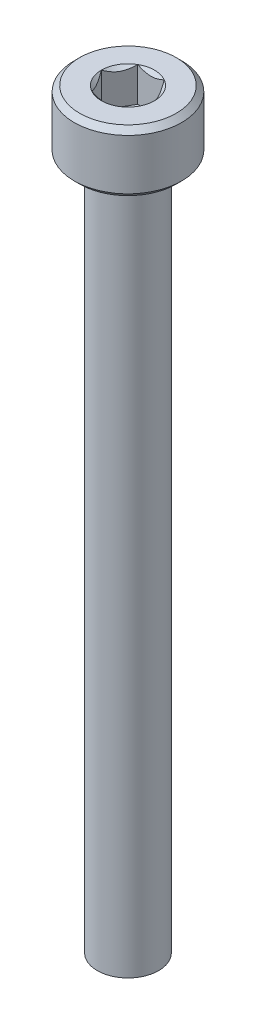
ISO-10303-21;
HEADER;
FILE_DESCRIPTION(('STEP AP214'),'2;1');
FILE_NAME('part.step','',(''),(''),'','','');
FILE_SCHEMA(('AUTOMOTIVE_DESIGN { 1 0 10303 214 1 1 1 1 }'));
ENDSEC;
DATA;
#1=APPLICATION_CONTEXT('core data for automotive mechanical design processes');
#2=APPLICATION_PROTOCOL_DEFINITION('international standard','automotive_design',2000,#1);
#3=PRODUCT_CONTEXT('',#1,'mechanical');
#4=PRODUCT('Part','Part','',(#3));
#5=PRODUCT_RELATED_PRODUCT_CATEGORY('part','',(#4));
#6=PRODUCT_DEFINITION_FORMATION('','',#4);
#7=PRODUCT_DEFINITION_CONTEXT('part definition',#1,'design');
#8=PRODUCT_DEFINITION('design','',#6,#7);
#9=PRODUCT_DEFINITION_SHAPE('','',#8);
#10=(LENGTH_UNIT() NAMED_UNIT(*) SI_UNIT(.MILLI.,.METRE.));
#11=(NAMED_UNIT(*) PLANE_ANGLE_UNIT() SI_UNIT($,.RADIAN.));
#12=(NAMED_UNIT(*) SI_UNIT($,.STERADIAN.) SOLID_ANGLE_UNIT());
#13=UNCERTAINTY_MEASURE_WITH_UNIT(LENGTH_MEASURE(1.E-05),#10,'distance_accuracy_value','');
#14=(GEOMETRIC_REPRESENTATION_CONTEXT(3) GLOBAL_UNCERTAINTY_ASSIGNED_CONTEXT((#13)) GLOBAL_UNIT_ASSIGNED_CONTEXT((#10,
#11,#12)) REPRESENTATION_CONTEXT('',''));
#15=CARTESIAN_POINT('',(0.,0.,0.));
#16=DIRECTION('',(0.,0.,1.));
#17=DIRECTION('',(1.,0.,0.));
#18=AXIS2_PLACEMENT_3D('',#15,#16,#17);
#19=CARTESIAN_POINT('',(0.,4.,0.));
#20=DIRECTION('',(0.,-1.,0.));
#21=DIRECTION('',(0.,0.,-1.));
#22=AXIS2_PLACEMENT_3D('',#19,#20,#21);
#23=CYLINDRICAL_SURFACE('',#22,3.5);
#24=CARTESIAN_POINT('',(0.,0.350000000000001,0.));
#25=DIRECTION('',(0.,1.,0.));
#26=DIRECTION('',(0.,0.,1.));
#27=AXIS2_PLACEMENT_3D('',#24,#25,#26);
#28=CIRCLE('',#27,3.5);
#29=CARTESIAN_POINT('',(0.,0.350000000000001,3.5));
#30=VERTEX_POINT('',#29);
#31=EDGE_CURVE('E227',#30,#30,#28,.T.);
#32=ORIENTED_EDGE('',*,*,#31,.T.);
#33=EDGE_LOOP('',(#32));
#34=FACE_BOUND('',#33,.T.);
#35=CARTESIAN_POINT('',(0.,3.65,0.));
#36=DIRECTION('',(0.,1.,0.));
#37=DIRECTION('',(0.,0.,1.));
#38=AXIS2_PLACEMENT_3D('',#35,#36,#37);
#39=CIRCLE('',#38,3.5);
#40=CARTESIAN_POINT('',(0.,3.65,3.5));
#41=VERTEX_POINT('',#40);
#42=EDGE_CURVE('E104',#41,#41,#39,.F.);
#43=ORIENTED_EDGE('',*,*,#42,.T.);
#44=EDGE_LOOP('',(#43));
#45=FACE_BOUND('',#44,.T.);
#46=ADVANCED_FACE('F32',(#34,#45),#23,.T.);
#47=CARTESIAN_POINT('',(0.,4.,0.));
#48=DIRECTION('',(0.,1.,0.));
#49=DIRECTION('',(0.,0.,1.));
#50=AXIS2_PLACEMENT_3D('',#47,#48,#49);
#51=PLANE('',#50);
#52=CARTESIAN_POINT('',(0.,4.,0.));
#53=DIRECTION('',(0.,1.,0.));
#54=DIRECTION('',(0.,0.,1.));
#55=AXIS2_PLACEMENT_3D('',#52,#53,#54);
#56=CIRCLE('',#55,3.15);
#57=CARTESIAN_POINT('',(0.,4.,3.15));
#58=VERTEX_POINT('',#57);
#59=EDGE_CURVE('E36',#58,#58,#56,.T.);
#60=ORIENTED_EDGE('',*,*,#59,.T.);
#61=EDGE_LOOP('',(#60));
#62=FACE_BOUND('',#61,.T.);
#63=CARTESIAN_POINT('',(0.,4.,0.));
#64=DIRECTION('',(0.,1.,0.));
#65=DIRECTION('',(0.,0.,1.));
#66=AXIS2_PLACEMENT_3D('',#63,#64,#65);
#67=CIRCLE('',#66,1.73205080756888);
#68=CARTESIAN_POINT('',(0.866025403784438,4.,1.5));
#69=VERTEX_POINT('',#68);
#70=CARTESIAN_POINT('',(1.73205080756888,4.,0.));
#71=VERTEX_POINT('',#70);
#72=EDGE_CURVE('E47',#69,#71,#67,.T.);
#73=ORIENTED_EDGE('',*,*,#72,.F.);
#74=CARTESIAN_POINT('',(-0.866025403784438,4.,1.5));
#75=VERTEX_POINT('',#74);
#76=EDGE_CURVE('E54',#75,#69,#67,.T.);
#77=ORIENTED_EDGE('',*,*,#76,.F.);
#78=CARTESIAN_POINT('',(-1.73205080756888,4.,0.));
#79=VERTEX_POINT('',#78);
#80=EDGE_CURVE('E127',#79,#75,#67,.T.);
#81=ORIENTED_EDGE('',*,*,#80,.F.);
#82=CARTESIAN_POINT('',(-0.866025403784439,4.,-1.5));
#83=VERTEX_POINT('',#82);
#84=EDGE_CURVE('E126',#83,#79,#67,.T.);
#85=ORIENTED_EDGE('',*,*,#84,.F.);
#86=CARTESIAN_POINT('',(0.866025403784438,4.,-1.5));
#87=VERTEX_POINT('',#86);
#88=EDGE_CURVE('E94',#87,#83,#67,.T.);
#89=ORIENTED_EDGE('',*,*,#88,.F.);
#90=EDGE_CURVE('E86',#71,#87,#67,.T.);
#91=ORIENTED_EDGE('',*,*,#90,.F.);
#92=EDGE_LOOP('',(#73,#77,#81,#85,#89,#91));
#93=FACE_BOUND('',#92,.T.);
#94=ADVANCED_FACE('F124',(#62,#93),#51,.T.);
#95=CARTESIAN_POINT('',(0.,0.,0.));
#96=DIRECTION('',(0.,1.,0.));
#97=DIRECTION('',(0.,0.,1.));
#98=AXIS2_PLACEMENT_3D('',#95,#96,#97);
#99=PLANE('',#98);
#100=CARTESIAN_POINT('',(0.,0.,0.));
#101=DIRECTION('',(0.,-1.,0.));
#102=DIRECTION('',(0.,0.,-1.));
#103=AXIS2_PLACEMENT_3D('',#100,#101,#102);
#104=CIRCLE('',#103,2.);
#105=CARTESIAN_POINT('',(0.,0.,2.));
#106=VERTEX_POINT('',#105);
#107=EDGE_CURVE('E11',#106,#106,#104,.T.);
#108=ORIENTED_EDGE('',*,*,#107,.F.);
#109=EDGE_LOOP('',(#108));
#110=FACE_BOUND('',#109,.T.);
#111=CARTESIAN_POINT('',(0.,0.,0.));
#112=DIRECTION('',(0.,1.,0.));
#113=DIRECTION('',(0.,0.,1.));
#114=AXIS2_PLACEMENT_3D('',#111,#112,#113);
#115=CIRCLE('',#114,3.15);
#116=CARTESIAN_POINT('',(0.,0.,3.15));
#117=VERTEX_POINT('',#116);
#118=EDGE_CURVE('E225',#117,#117,#115,.F.);
#119=ORIENTED_EDGE('',*,*,#118,.T.);
#120=EDGE_LOOP('',(#119));
#121=FACE_BOUND('',#120,.T.);
#122=ADVANCED_FACE('F208',(#110,#121),#99,.F.);
#123=CARTESIAN_POINT('',(0.,4.,0.));
#124=DIRECTION('',(0.,1.,0.));
#125=DIRECTION('',(0.,0.,1.));
#126=AXIS2_PLACEMENT_3D('',#123,#124,#125);
#127=CONICAL_SURFACE('',#126,1.73205080756888,0.78539816339745);
#128=ORIENTED_EDGE('',*,*,#88,.T.);
#129=CARTESIAN_POINT('',(-1.72720812969692,4.55557851627079,-1.5));
#130=CARTESIAN_POINT('',(-1.68515175699268,4.52382990785743,-1.5));
#131=CARTESIAN_POINT('',(-1.64286104748673,4.49239259380738,-1.5));
#132=CARTESIAN_POINT('',(-1.55771581035942,4.43026908755641,-1.5));
#133=CARTESIAN_POINT('',(-1.51486114386668,4.3995830858922,-1.5));
#134=CARTESIAN_POINT('',(-1.3846813415127,4.30840719242716,-1.5));
#135=CARTESIAN_POINT('',(-1.29637976071654,4.24928834342677,-1.5));
#136=CARTESIAN_POINT('',(-1.11121478730467,4.1332309963165,-1.5));
#137=CARTESIAN_POINT('',(-1.01415038238167,4.07660955873301,-1.5));
#138=CARTESIAN_POINT('',(-0.815173408897606,3.97303688126565,-1.5));
#139=CARTESIAN_POINT('',(-0.713278669253285,3.92605304154167,-1.5));
#140=CARTESIAN_POINT('',(-0.560333774943112,3.86857266843083,-1.5));
#141=CARTESIAN_POINT('',(-0.511547982948042,3.85207538775725,-1.5));
#142=CARTESIAN_POINT('',(-0.412798620136866,3.822997512927,-1.5));
#143=CARTESIAN_POINT('',(-0.362834968437563,3.81041718859402,-1.5));
#144=CARTESIAN_POINT('',(-0.262863235444982,3.79003619414677,-1.5));
#145=CARTESIAN_POINT('',(-0.212872113808023,3.78215363274598,-1.5));
#146=CARTESIAN_POINT('',(-0.112355243569545,3.771322063969,-1.5));
#147=CARTESIAN_POINT('',(-0.0618295883726279,3.76837220852435,-1.5));
#148=CARTESIAN_POINT('',(0.037429173332384,3.76762485772485,-1.5));
#149=CARTESIAN_POINT('',(0.0861609672002989,3.76964473355808,-1.5));
#150=CARTESIAN_POINT('',(0.183206937768827,3.77832255289676,-1.5));
#151=CARTESIAN_POINT('',(0.231521073438269,3.78498094696846,-1.5));
#152=CARTESIAN_POINT('',(0.328199853425436,3.80268524412257,-1.5));
#153=CARTESIAN_POINT('',(0.376550616310328,3.81380581125704,-1.5));
#154=CARTESIAN_POINT('',(0.472195697125598,3.83984341404871,-1.5));
#155=CARTESIAN_POINT('',(0.51949010309274,3.85476013204094,-1.5));
#156=CARTESIAN_POINT('',(0.668391282696624,3.90733522359607,-1.5));
#157=CARTESIAN_POINT('',(0.767878709508552,3.95098128747198,-1.5));
#158=CARTESIAN_POINT('',(0.962179866690724,4.0480229945931,-1.5));
#159=CARTESIAN_POINT('',(1.05697519961444,4.10145366508953,-1.5));
#160=CARTESIAN_POINT('',(1.23814273533383,4.21168585200456,-1.5));
#161=CARTESIAN_POINT('',(1.3246994218129,4.2681879206986,-1.5));
#162=CARTESIAN_POINT('',(1.45222331290673,4.35553430157866,-1.5));
#163=CARTESIAN_POINT('',(1.49418091978756,4.38495775868004,-1.5));
#164=CARTESIAN_POINT('',(1.57752272931476,4.44458282183046,-1.5));
#165=CARTESIAN_POINT('',(1.61890708647354,4.47478421166444,-1.5));
#166=CARTESIAN_POINT('',(1.66005278019494,4.50530817860946,-1.5));
#167=B_SPLINE_CURVE_WITH_KNOTS('',3,(#129,#130,#131,#132,#133,#134,#135,#136,#137,#138,#139,
#140,#141,#142,#143,#144,#145,#146,#147,#148,#149,#150,#151,#152,#153,#154,#155,#156,#157,#158,
#159,#160,#161,#162,#163,#164,#165,#166),.UNSPECIFIED.,.F.,.F.,(4,2,2,2,2,2,2,2,2,2,2,2,2,2,2,2,
2,2,4),(0.,0.158079548982669,0.316198780993942,0.634850417346958,0.971690311361509,
1.30737131660667,1.46173961127089,1.61611853740677,1.76772101421409,1.91929742368538,
2.065387412096,2.21149159305544,2.36014984633872,2.50879566386709,2.83376031422673,
3.15991186985652,3.46985601802197,3.62358896039974,3.7772796264207),.UNSPECIFIED.);
#168=EDGE_CURVE('E99',#87,#83,#167,.F.);
#169=ORIENTED_EDGE('',*,*,#168,.F.);
#170=EDGE_LOOP('',(#128,#169));
#171=FACE_BOUND('',#170,.T.);
#172=ADVANCED_FACE('F100',(#171),#127,.F.);
#173=ORIENTED_EDGE('',*,*,#84,.T.);
#174=CARTESIAN_POINT('',(-0.865909933730601,4.00011548160007,-1.5002));
#175=CARTESIAN_POINT('',(-0.895682611594166,3.97036547606733,-1.44863220926292));
#176=CARTESIAN_POINT('',(-0.925953159489765,3.94236248391031,-1.3962020823348));
#177=CARTESIAN_POINT('',(-0.987678321317123,3.89108923044014,-1.2892909659444));
#178=CARTESIAN_POINT('',(-1.01913880822717,3.86784750504437,-1.23479980418534));
#179=CARTESIAN_POINT('',(-1.08257741237344,3.82803372899222,-1.12492091864275));
#180=CARTESIAN_POINT('',(-1.11453936608521,3.8113615856709,-1.0695611909048));
#181=CARTESIAN_POINT('',(-1.1791670593912,3.7856744568181,-0.957622742522849));
#182=CARTESIAN_POINT('',(-1.21183082354213,3.77664029047887,-0.901047443446992));
#183=CARTESIAN_POINT('',(-1.26812411040032,3.76848908122685,-0.803544610483559));
#184=CARTESIAN_POINT('',(-1.29168087824208,3.76728225298922,-0.762743091719534));
#185=CARTESIAN_POINT('',(-1.33875285845138,3.76931405716227,-0.681212030384142));
#186=CARTESIAN_POINT('',(-1.36226806050018,3.77255367074831,-0.64048250568537));
#187=CARTESIAN_POINT('',(-1.40907206156905,3.78329198598196,-0.559415597836584));
#188=CARTESIAN_POINT('',(-1.43236062923612,3.79079465301873,-0.519078615401712));
#189=CARTESIAN_POINT('',(-1.47854689118996,3.80965161192829,-0.439081663085969));
#190=CARTESIAN_POINT('',(-1.50144441326545,3.82100755701858,-0.399421991483792));
#191=CARTESIAN_POINT('',(-1.56009461325633,3.85472164759267,-0.297836865225515));
#192=CARTESIAN_POINT('',(-1.59548353987866,3.87962184909337,-0.236541446290311));
#193=CARTESIAN_POINT('',(-1.64751843074894,3.92165665327158,-0.146414371536686));
#194=CARTESIAN_POINT('',(-1.66466545167617,3.9364251535591,-0.116714860092282));
#195=CARTESIAN_POINT('',(-1.69864410935691,3.96731056594017,-0.0578620986162487));
#196=CARTESIAN_POINT('',(-1.71547589206761,3.98342683412171,-0.0287085957793624));
#197=CARTESIAN_POINT('',(-1.73216627762272,4.00011548160007,0.00020000000000028));
#198=B_SPLINE_CURVE_WITH_KNOTS('',3,(#174,#175,#176,#177,#178,#179,#180,#181,#182,#183,#184,
#185,#186,#187,#188,#189,#190,#191,#192,#193,#194,#195,#196,#197),.UNSPECIFIED.,.F.,.F.,(4,2,2,
2,2,2,2,2,2,2,2,4),(0.,0.199829143693304,0.400822987382388,0.598623720538181,0.795926240188889,
0.937113067959881,1.07833105577193,1.21968061668222,1.36109089931054,1.58570969637565,
1.69770705470964,1.80965120737194),.UNSPECIFIED.);
#199=EDGE_CURVE('E129',#83,#79,#198,.T.);
#200=ORIENTED_EDGE('',*,*,#199,.F.);
#201=EDGE_LOOP('',(#173,#200));
#202=FACE_BOUND('',#201,.T.);
#203=ADVANCED_FACE('F240',(#202),#127,.F.);
#204=ORIENTED_EDGE('',*,*,#80,.T.);
#205=CARTESIAN_POINT('',(-1.73216627762272,4.00011548160007,-0.000199999999999694));
#206=CARTESIAN_POINT('',(-1.70239359975915,3.97036547606733,0.051367790737076));
#207=CARTESIAN_POINT('',(-1.67212305186355,3.94236248391031,0.103797917665201));
#208=CARTESIAN_POINT('',(-1.61039789003619,3.89108923044014,0.210709034055597));
#209=CARTESIAN_POINT('',(-1.57893740312614,3.86784750504437,0.265200195814662));
#210=CARTESIAN_POINT('',(-1.51549879897987,3.82803372899222,0.375079081357249));
#211=CARTESIAN_POINT('',(-1.4835368452681,3.8113615856709,0.4304388090952));
#212=CARTESIAN_POINT('',(-1.41890915196211,3.7856744568181,0.542377257477151));
#213=CARTESIAN_POINT('',(-1.38624538781118,3.77664029047887,0.598952556553009));
#214=CARTESIAN_POINT('',(-1.32995210095299,3.76848908122685,0.696455389516441));
#215=CARTESIAN_POINT('',(-1.30639533311124,3.76728225298922,0.737256908280466));
#216=CARTESIAN_POINT('',(-1.25932335290193,3.76931405716227,0.818787969615858));
#217=CARTESIAN_POINT('',(-1.23580815085313,3.77255367074831,0.85951749431463));
#218=CARTESIAN_POINT('',(-1.18900414978427,3.78329198598196,0.940584402163416));
#219=CARTESIAN_POINT('',(-1.1657155821172,3.79079465301873,0.980921384598288));
#220=CARTESIAN_POINT('',(-1.11952932016335,3.80965161192829,1.06091833691403));
#221=CARTESIAN_POINT('',(-1.09663179808786,3.82100755701859,1.10057800851621));
#222=CARTESIAN_POINT('',(-1.03798159809698,3.85472164759267,1.20216313477448));
#223=CARTESIAN_POINT('',(-1.00259267147465,3.87962184909337,1.26345855370969));
#224=CARTESIAN_POINT('',(-0.950557780604375,3.92165665327158,1.35358562846331));
#225=CARTESIAN_POINT('',(-0.933410759677147,3.9364251535591,1.38328513990772));
#226=CARTESIAN_POINT('',(-0.899432101996407,3.96731056594017,1.44213790138375));
#227=CARTESIAN_POINT('',(-0.88260031928571,3.98342683412171,1.47129140422064));
#228=CARTESIAN_POINT('',(-0.865909933730601,4.00011548160007,1.5002));
#229=B_SPLINE_CURVE_WITH_KNOTS('',3,(#205,#206,#207,#208,#209,#210,#211,#212,#213,#214,#215,
#216,#217,#218,#219,#220,#221,#222,#223,#224,#225,#226,#227,#228),.UNSPECIFIED.,.F.,.F.,(4,2,2,
2,2,2,2,2,2,2,2,4),(0.,0.199829143693305,0.400822987382389,0.598623720538181,0.795926240188889,
0.937113067959881,1.07833105577193,1.21968061668222,1.36109089931054,1.58570969637565,
1.69770705470964,1.80965120737194),.UNSPECIFIED.);
#230=EDGE_CURVE('E139',#79,#75,#229,.T.);
#231=ORIENTED_EDGE('',*,*,#230,.F.);
#232=EDGE_LOOP('',(#204,#231));
#233=FACE_BOUND('',#232,.T.);
#234=ADVANCED_FACE('F256',(#233),#127,.F.);
#235=ORIENTED_EDGE('',*,*,#76,.T.);
#236=CARTESIAN_POINT('',(-1.72720812994822,4.55557851646053,1.5));
#237=CARTESIAN_POINT('',(-1.68515175723693,4.52382990803985,1.5));
#238=CARTESIAN_POINT('',(-1.64286104772391,4.49239259398251,1.5));
#239=CARTESIAN_POINT('',(-1.55771581058238,4.43026908771699,1.5));
#240=CARTESIAN_POINT('',(-1.51486114408249,4.39958308604553,1.5));
#241=CARTESIAN_POINT('',(-1.38468134170665,4.30840719255859,1.5));
#242=CARTESIAN_POINT('',(-1.29637976089561,4.24928834354366,1.5));
#243=CARTESIAN_POINT('',(-1.11121478745132,4.13323099640349,1.5));
#244=CARTESIAN_POINT('',(-1.01415038251067,4.07660955880473,1.5));
#245=CARTESIAN_POINT('',(-0.815173408989814,3.9730368813091,1.5));
#246=CARTESIAN_POINT('',(-0.71327866932636,3.92605304157206,1.5));
#247=CARTESIAN_POINT('',(-0.56033377500179,3.86857266845154,1.5));
#248=CARTESIAN_POINT('',(-0.511547983012749,3.85207538777834,1.5));
#249=CARTESIAN_POINT('',(-0.412798620213828,3.82299751294763,1.5));
#250=CARTESIAN_POINT('',(-0.362834968520751,3.8104171886138,1.5));
#251=CARTESIAN_POINT('',(-0.262863235540417,3.79003619416346,1.5));
#252=CARTESIAN_POINT('',(-0.212872113909475,3.78215363276045,1.5));
#253=CARTESIAN_POINT('',(-0.112355243682832,3.77132206397768,1.5));
#254=CARTESIAN_POINT('',(-0.061829588491731,3.76837220852945,1.5));
#255=CARTESIAN_POINT('',(0.0374291732025493,3.76762485772178,1.5));
#256=CARTESIAN_POINT('',(0.086160967065534,3.76964473355048,1.5));
#257=CARTESIAN_POINT('',(0.183206937624695,3.77832255287941,1.5));
#258=CARTESIAN_POINT('',(0.2315210732897,3.78498094694588,1.5));
#259=CARTESIAN_POINT('',(0.328199853268108,3.80268524408904,1.5));
#260=CARTESIAN_POINT('',(0.376550616148692,3.81380581121775,1.5));
#261=CARTESIAN_POINT('',(0.47219569695576,3.83984341399777,1.5));
#262=CARTESIAN_POINT('',(0.51949010291901,3.8547601319841,1.5));
#263=CARTESIAN_POINT('',(0.668391282485064,3.90733522351148,1.5));
#264=CARTESIAN_POINT('',(0.767878709264951,3.95098128736184,1.5));
#265=CARTESIAN_POINT('',(0.9621798663855,4.04802299442906,1.5));
#266=CARTESIAN_POINT('',(1.05697519927965,4.10145366489712,1.5));
#267=CARTESIAN_POINT('',(1.23814273494588,4.21168585175783,1.5));
#268=CARTESIAN_POINT('',(1.32469942140117,4.26818792042618,1.5));
#269=CARTESIAN_POINT('',(1.45222331245985,4.35553430126784,1.5));
#270=CARTESIAN_POINT('',(1.49418091932912,4.38495775835653,1.5));
#271=CARTESIAN_POINT('',(1.5775227288333,4.44458282148157,1.5));
#272=CARTESIAN_POINT('',(1.6189070859806,4.47478421130286,1.5));
#273=CARTESIAN_POINT('',(1.66005277969054,4.50530817823521,1.5));
#274=B_SPLINE_CURVE_WITH_KNOTS('',3,(#236,#237,#238,#239,#240,#241,#242,#243,#244,#245,#246,
#247,#248,#249,#250,#251,#252,#253,#254,#255,#256,#257,#258,#259,#260,#261,#262,#263,#264,#265,
#266,#267,#268,#269,#270,#271,#272,#273),.UNSPECIFIED.,.F.,.F.,(4,2,2,2,2,2,2,2,2,2,2,2,2,2,2,2,
2,2,4),(0.,0.158079549012757,0.316198781054129,0.634850417468465,0.971690311551782,
1.30737131686505,1.46173961151184,1.61611853763032,1.76772101442095,1.91929742387554,
2.06538741227089,2.21149159321503,2.36014984648185,2.50879566399376,2.83376031423511,
3.15991186974582,3.4698560178094,3.62358896013692,3.77727962610764),.UNSPECIFIED.);
#275=EDGE_CURVE('E168',#75,#69,#274,.T.);
#276=ORIENTED_EDGE('',*,*,#275,.F.);
#277=EDGE_LOOP('',(#235,#276));
#278=FACE_BOUND('',#277,.T.);
#279=ADVANCED_FACE('F286',(#278),#127,.F.);
#280=ORIENTED_EDGE('',*,*,#72,.T.);
#281=CARTESIAN_POINT('',(0.865909933730601,4.00011548160007,1.5002));
#282=CARTESIAN_POINT('',(0.895682611594166,3.97036547606733,1.44863220926292));
#283=CARTESIAN_POINT('',(0.925953159489765,3.94236248391031,1.3962020823348));
#284=CARTESIAN_POINT('',(0.987678321317124,3.89108923044014,1.2892909659444));
#285=CARTESIAN_POINT('',(1.01913880822717,3.86784750504437,1.23479980418534));
#286=CARTESIAN_POINT('',(1.08257741237344,3.82803372899222,1.12492091864275));
#287=CARTESIAN_POINT('',(1.11453936608521,3.8113615856709,1.0695611909048));
#288=CARTESIAN_POINT('',(1.1791670593912,3.7856744568181,0.95762274252285));
#289=CARTESIAN_POINT('',(1.21183082354213,3.77664029047887,0.901047443446992));
#290=CARTESIAN_POINT('',(1.26812411040032,3.76848908122685,0.80354461048356));
#291=CARTESIAN_POINT('',(1.29168087824208,3.76728225298922,0.762743091719534));
#292=CARTESIAN_POINT('',(1.33875285845138,3.76931405716227,0.681212030384142));
#293=CARTESIAN_POINT('',(1.36226806050018,3.77255367074831,0.640482505685371));
#294=CARTESIAN_POINT('',(1.40907206156905,3.78329198598196,0.559415597836584));
#295=CARTESIAN_POINT('',(1.43236062923612,3.79079465301873,0.519078615401712));
#296=CARTESIAN_POINT('',(1.47854689118996,3.80965161192829,0.43908166308597));
#297=CARTESIAN_POINT('',(1.50144441326545,3.82100755701859,0.399421991483792));
#298=CARTESIAN_POINT('',(1.56009461325633,3.85472164759267,0.297836865225515));
#299=CARTESIAN_POINT('',(1.59548353987866,3.87962184909337,0.236541446290311));
#300=CARTESIAN_POINT('',(1.64751843074894,3.92165665327158,0.146414371536686));
#301=CARTESIAN_POINT('',(1.66466545167617,3.9364251535591,0.116714860092282));
#302=CARTESIAN_POINT('',(1.69864410935691,3.96731056594017,0.0578620986162488));
#303=CARTESIAN_POINT('',(1.71547589206761,3.98342683412171,0.0287085957793626));
#304=CARTESIAN_POINT('',(1.73216627762272,4.00011548160007,-0.000200000000000026));
#305=B_SPLINE_CURVE_WITH_KNOTS('',3,(#281,#282,#283,#284,#285,#286,#287,#288,#289,#290,#291,
#292,#293,#294,#295,#296,#297,#298,#299,#300,#301,#302,#303,#304),.UNSPECIFIED.,.F.,.F.,(4,2,2,
2,2,2,2,2,2,2,2,4),(0.,0.199829143693305,0.400822987382389,0.59862372053818,0.795926240188889,
0.937113067959881,1.07833105577193,1.21968061668222,1.36109089931054,1.58570969637565,
1.69770705470964,1.80965120737194),.UNSPECIFIED.);
#306=EDGE_CURVE('E114',#69,#71,#305,.T.);
#307=ORIENTED_EDGE('',*,*,#306,.F.);
#308=EDGE_LOOP('',(#280,#307));
#309=FACE_BOUND('',#308,.T.);
#310=ADVANCED_FACE('F154',(#309),#127,.F.);
#311=ORIENTED_EDGE('',*,*,#90,.T.);
#312=CARTESIAN_POINT('',(1.73216627762272,4.00011548160007,0.000200000000000282));
#313=CARTESIAN_POINT('',(1.70239359975915,3.97036547606733,-0.0513677907370753));
#314=CARTESIAN_POINT('',(1.67212305186355,3.94236248391031,-0.103797917665201));
#315=CARTESIAN_POINT('',(1.61039789003619,3.89108923044014,-0.210709034055596));
#316=CARTESIAN_POINT('',(1.57893740312614,3.86784750504437,-0.265200195814661));
#317=CARTESIAN_POINT('',(1.51549879897987,3.82803372899222,-0.375079081357248));
#318=CARTESIAN_POINT('',(1.4835368452681,3.8113615856709,-0.430438809095199));
#319=CARTESIAN_POINT('',(1.41890915196211,3.7856744568181,-0.54237725747715));
#320=CARTESIAN_POINT('',(1.38624538781118,3.77664029047887,-0.598952556553008));
#321=CARTESIAN_POINT('',(1.32995210095299,3.76848908122685,-0.69645538951644));
#322=CARTESIAN_POINT('',(1.30639533311124,3.76728225298922,-0.737256908280466));
#323=CARTESIAN_POINT('',(1.25932335290193,3.76931405716227,-0.818787969615858));
#324=CARTESIAN_POINT('',(1.23580815085313,3.77255367074831,-0.85951749431463));
#325=CARTESIAN_POINT('',(1.18900414978427,3.78329198598196,-0.940584402163416));
#326=CARTESIAN_POINT('',(1.1657155821172,3.79079465301873,-0.980921384598288));
#327=CARTESIAN_POINT('',(1.11952932016335,3.80965161192829,-1.06091833691403));
#328=CARTESIAN_POINT('',(1.09663179808786,3.82100755701858,-1.10057800851621));
#329=CARTESIAN_POINT('',(1.03798159809698,3.85472164759267,-1.20216313477448));
#330=CARTESIAN_POINT('',(1.00259267147465,3.87962184909337,-1.26345855370969));
#331=CARTESIAN_POINT('',(0.950557780604375,3.92165665327158,-1.35358562846331));
#332=CARTESIAN_POINT('',(0.933410759677148,3.9364251535591,-1.38328513990772));
#333=CARTESIAN_POINT('',(0.899432101996407,3.96731056594017,-1.44213790138375));
#334=CARTESIAN_POINT('',(0.88260031928571,3.98342683412171,-1.47129140422064));
#335=CARTESIAN_POINT('',(0.865909933730601,4.00011548160007,-1.5002));
#336=B_SPLINE_CURVE_WITH_KNOTS('',3,(#312,#313,#314,#315,#316,#317,#318,#319,#320,#321,#322,
#323,#324,#325,#326,#327,#328,#329,#330,#331,#332,#333,#334,#335),.UNSPECIFIED.,.F.,.F.,(4,2,2,
2,2,2,2,2,2,2,2,4),(0.,0.199829143693305,0.400822987382389,0.598623720538181,0.79592624018889,
0.937113067959881,1.07833105577193,1.21968061668222,1.36109089931054,1.58570969637566,
1.69770705470964,1.80965120737194),.UNSPECIFIED.);
#337=EDGE_CURVE('E90',#71,#87,#336,.T.);
#338=ORIENTED_EDGE('',*,*,#337,.F.);
#339=EDGE_LOOP('',(#311,#338));
#340=FACE_BOUND('',#339,.T.);
#341=ADVANCED_FACE('F88',(#340),#127,.F.);
#342=CARTESIAN_POINT('',(0.,1.75,0.));
#343=DIRECTION('',(0.,1.,0.));
#344=DIRECTION('',(0.,0.,1.));
#345=AXIS2_PLACEMENT_3D('',#342,#343,#344);
#346=PLANE('',#345);
#347=DIRECTION('',(-0.5,0.,-0.866025403784439));
#348=VECTOR('',#347,1.);
#349=CARTESIAN_POINT('',(1.73205080756888,1.75,0.));
#350=LINE('',#349,#348);
#351=CARTESIAN_POINT('',(1.73205080756888,1.75,0.));
#352=VERTEX_POINT('',#351);
#353=CARTESIAN_POINT('',(0.866025403784438,1.75,-1.5));
#354=VERTEX_POINT('',#353);
#355=EDGE_CURVE('E113',#352,#354,#350,.T.);
#356=ORIENTED_EDGE('',*,*,#355,.T.);
#357=DIRECTION('',(-1.,0.,0.));
#358=VECTOR('',#357,1.);
#359=CARTESIAN_POINT('',(0.866025403784438,1.75,-1.5));
#360=LINE('',#359,#358);
#361=CARTESIAN_POINT('',(-0.866025403784439,1.75,-1.5));
#362=VERTEX_POINT('',#361);
#363=EDGE_CURVE('E118',#354,#362,#360,.T.);
#364=ORIENTED_EDGE('',*,*,#363,.T.);
#365=DIRECTION('',(-0.5,0.,0.866025403784439));
#366=VECTOR('',#365,1.);
#367=CARTESIAN_POINT('',(-0.866025403784439,1.75,-1.5));
#368=LINE('',#367,#366);
#369=CARTESIAN_POINT('',(-1.73205080756888,1.75,0.));
#370=VERTEX_POINT('',#369);
#371=EDGE_CURVE('E280',#362,#370,#368,.T.);
#372=ORIENTED_EDGE('',*,*,#371,.T.);
#373=DIRECTION('',(0.5,0.,0.866025403784439));
#374=VECTOR('',#373,1.);
#375=CARTESIAN_POINT('',(-1.73205080756888,1.75,0.));
#376=LINE('',#375,#374);
#377=CARTESIAN_POINT('',(-0.866025403784438,1.75,1.5));
#378=VERTEX_POINT('',#377);
#379=EDGE_CURVE('E263',#370,#378,#376,.T.);
#380=ORIENTED_EDGE('',*,*,#379,.T.);
#381=DIRECTION('',(1.,0.,0.));
#382=VECTOR('',#381,1.);
#383=CARTESIAN_POINT('',(-0.866025403784438,1.75,1.5));
#384=LINE('',#383,#382);
#385=CARTESIAN_POINT('',(0.866025403784439,1.75,1.5));
#386=VERTEX_POINT('',#385);
#387=EDGE_CURVE('E276',#378,#386,#384,.T.);
#388=ORIENTED_EDGE('',*,*,#387,.T.);
#389=DIRECTION('',(0.5,0.,-0.866025403784439));
#390=VECTOR('',#389,1.);
#391=CARTESIAN_POINT('',(0.866025403784439,1.75,1.5));
#392=LINE('',#391,#390);
#393=EDGE_CURVE('E121',#386,#352,#392,.T.);
#394=ORIENTED_EDGE('',*,*,#393,.T.);
#395=EDGE_LOOP('',(#356,#364,#372,#380,#388,#394));
#396=FACE_BOUND('',#395,.T.);
#397=ADVANCED_FACE('F153',(#396),#346,.T.);
#398=CARTESIAN_POINT('',(0.866025403784438,1.75,-1.5));
#399=DIRECTION('',(0.,0.,-1.));
#400=DIRECTION('',(-1.,0.,0.));
#401=AXIS2_PLACEMENT_3D('',#398,#399,#400);
#402=PLANE('',#401);
#403=DIRECTION('',(0.,1.,0.));
#404=VECTOR('',#403,1.);
#405=CARTESIAN_POINT('',(0.866025403784438,1.75,-1.5));
#406=LINE('',#405,#404);
#407=EDGE_CURVE('E111',#354,#87,#406,.T.);
#408=ORIENTED_EDGE('',*,*,#407,.T.);
#409=ORIENTED_EDGE('',*,*,#168,.T.);
#410=DIRECTION('',(0.,1.,0.));
#411=VECTOR('',#410,1.);
#412=CARTESIAN_POINT('',(-0.866025403784439,1.75,-1.5));
#413=LINE('',#412,#411);
#414=EDGE_CURVE('E120',#362,#83,#413,.T.);
#415=ORIENTED_EDGE('',*,*,#414,.F.);
#416=ORIENTED_EDGE('',*,*,#363,.F.);
#417=EDGE_LOOP('',(#408,#409,#415,#416));
#418=FACE_BOUND('',#417,.T.);
#419=ADVANCED_FACE('F116',(#418),#402,.F.);
#420=CARTESIAN_POINT('',(-0.866025403784439,1.75,-1.5));
#421=DIRECTION('',(-0.866025403784439,0.,-0.5));
#422=DIRECTION('',(-0.5,0.,0.866025403784439));
#423=AXIS2_PLACEMENT_3D('',#420,#421,#422);
#424=PLANE('',#423);
#425=ORIENTED_EDGE('',*,*,#414,.T.);
#426=ORIENTED_EDGE('',*,*,#199,.T.);
#427=DIRECTION('',(0.,1.,0.));
#428=VECTOR('',#427,1.);
#429=CARTESIAN_POINT('',(-1.73205080756888,1.75,0.));
#430=LINE('',#429,#428);
#431=EDGE_CURVE('E259',#370,#79,#430,.T.);
#432=ORIENTED_EDGE('',*,*,#431,.F.);
#433=ORIENTED_EDGE('',*,*,#371,.F.);
#434=EDGE_LOOP('',(#425,#426,#432,#433));
#435=FACE_BOUND('',#434,.T.);
#436=ADVANCED_FACE('F146',(#435),#424,.F.);
#437=CARTESIAN_POINT('',(-1.73205080756888,1.75,0.));
#438=DIRECTION('',(-0.866025403784439,0.,0.5));
#439=DIRECTION('',(0.5,0.,0.866025403784439));
#440=AXIS2_PLACEMENT_3D('',#437,#438,#439);
#441=PLANE('',#440);
#442=ORIENTED_EDGE('',*,*,#431,.T.);
#443=ORIENTED_EDGE('',*,*,#230,.T.);
#444=DIRECTION('',(0.,1.,0.));
#445=VECTOR('',#444,1.);
#446=CARTESIAN_POINT('',(-0.866025403784438,1.75,1.5));
#447=LINE('',#446,#445);
#448=EDGE_CURVE('E265',#378,#75,#447,.T.);
#449=ORIENTED_EDGE('',*,*,#448,.F.);
#450=ORIENTED_EDGE('',*,*,#379,.F.);
#451=EDGE_LOOP('',(#442,#443,#449,#450));
#452=FACE_BOUND('',#451,.T.);
#453=ADVANCED_FACE('F192',(#452),#441,.F.);
#454=CARTESIAN_POINT('',(-0.866025403784438,1.75,1.5));
#455=DIRECTION('',(0.,0.,1.));
#456=DIRECTION('',(1.,0.,0.));
#457=AXIS2_PLACEMENT_3D('',#454,#455,#456);
#458=PLANE('',#457);
#459=ORIENTED_EDGE('',*,*,#448,.T.);
#460=ORIENTED_EDGE('',*,*,#275,.T.);
#461=DIRECTION('',(0.,1.,0.));
#462=VECTOR('',#461,1.);
#463=CARTESIAN_POINT('',(0.866025403784439,1.75,1.5));
#464=LINE('',#463,#462);
#465=EDGE_CURVE('E267',#386,#69,#464,.T.);
#466=ORIENTED_EDGE('',*,*,#465,.F.);
#467=ORIENTED_EDGE('',*,*,#387,.F.);
#468=EDGE_LOOP('',(#459,#460,#466,#467));
#469=FACE_BOUND('',#468,.T.);
#470=ADVANCED_FACE('F188',(#469),#458,.F.);
#471=CARTESIAN_POINT('',(0.866025403784439,1.75,1.5));
#472=DIRECTION('',(0.866025403784439,0.,0.5));
#473=DIRECTION('',(0.5,0.,-0.866025403784439));
#474=AXIS2_PLACEMENT_3D('',#471,#472,#473);
#475=PLANE('',#474);
#476=ORIENTED_EDGE('',*,*,#465,.T.);
#477=ORIENTED_EDGE('',*,*,#306,.T.);
#478=DIRECTION('',(0.,1.,0.));
#479=VECTOR('',#478,1.);
#480=CARTESIAN_POINT('',(1.73205080756888,1.75,0.));
#481=LINE('',#480,#479);
#482=EDGE_CURVE('E105',#352,#71,#481,.T.);
#483=ORIENTED_EDGE('',*,*,#482,.F.);
#484=ORIENTED_EDGE('',*,*,#393,.F.);
#485=EDGE_LOOP('',(#476,#477,#483,#484));
#486=FACE_BOUND('',#485,.T.);
#487=ADVANCED_FACE('F185',(#486),#475,.F.);
#488=CARTESIAN_POINT('',(1.73205080756888,1.75,0.));
#489=DIRECTION('',(0.866025403784439,0.,-0.5));
#490=DIRECTION('',(-0.5,0.,-0.866025403784439));
#491=AXIS2_PLACEMENT_3D('',#488,#489,#490);
#492=PLANE('',#491);
#493=ORIENTED_EDGE('',*,*,#482,.T.);
#494=ORIENTED_EDGE('',*,*,#337,.T.);
#495=ORIENTED_EDGE('',*,*,#407,.F.);
#496=ORIENTED_EDGE('',*,*,#355,.F.);
#497=EDGE_LOOP('',(#493,#494,#495,#496));
#498=FACE_BOUND('',#497,.T.);
#499=ADVANCED_FACE('F109',(#498),#492,.F.);
#500=CARTESIAN_POINT('',(0.,0.350000000000001,0.));
#501=DIRECTION('',(0.,1.,0.));
#502=DIRECTION('',(0.,0.,1.));
#503=AXIS2_PLACEMENT_3D('',#500,#501,#502);
#504=CONICAL_SURFACE('',#503,3.5,0.78539816339745);
#505=ORIENTED_EDGE('',*,*,#118,.F.);
#506=EDGE_LOOP('',(#505));
#507=FACE_BOUND('',#506,.T.);
#508=ORIENTED_EDGE('',*,*,#31,.F.);
#509=EDGE_LOOP('',(#508));
#510=FACE_BOUND('',#509,.T.);
#511=ADVANCED_FACE('F214',(#507,#510),#504,.T.);
#512=CARTESIAN_POINT('',(0.,4.,0.));
#513=DIRECTION('',(0.,-1.,0.));
#514=DIRECTION('',(0.,0.,-1.));
#515=AXIS2_PLACEMENT_3D('',#512,#513,#514);
#516=CONICAL_SURFACE('',#515,3.15,0.785398163397448);
#517=ORIENTED_EDGE('',*,*,#42,.F.);
#518=EDGE_LOOP('',(#517));
#519=FACE_BOUND('',#518,.T.);
#520=ORIENTED_EDGE('',*,*,#59,.F.);
#521=EDGE_LOOP('',(#520));
#522=FACE_BOUND('',#521,.T.);
#523=ADVANCED_FACE('F34',(#519,#522),#516,.T.);
#524=CARTESIAN_POINT('',(0.,-45.,0.));
#525=DIRECTION('',(0.,1.,0.));
#526=DIRECTION('',(0.,0.,1.));
#527=AXIS2_PLACEMENT_3D('',#524,#525,#526);
#528=CYLINDRICAL_SURFACE('',#527,2.);
#529=CARTESIAN_POINT('',(0.,-45.,0.));
#530=DIRECTION('',(0.,-1.,0.));
#531=DIRECTION('',(0.,0.,-1.));
#532=AXIS2_PLACEMENT_3D('',#529,#530,#531);
#533=CIRCLE('',#532,2.);
#534=CARTESIAN_POINT('',(0.,-45.,2.));
#535=VERTEX_POINT('',#534);
#536=EDGE_CURVE('E252',#535,#535,#533,.T.);
#537=CARTESIAN_POINT('',(0.,-45.,2.));
#538=CARTESIAN_POINT('',(0.,-44.53125,2.));
#539=CARTESIAN_POINT('',(0.,-44.0625,2.));
#540=CARTESIAN_POINT('',(0.,-43.125,2.));
#541=CARTESIAN_POINT('',(0.,-42.65625,2.));
#542=CARTESIAN_POINT('',(0.,-41.71875,2.));
#543=CARTESIAN_POINT('',(0.,-41.25,2.));
#544=CARTESIAN_POINT('',(0.,-40.3125,2.));
#545=CARTESIAN_POINT('',(0.,-39.84375,2.));
#546=CARTESIAN_POINT('',(0.,-38.90625,2.));
#547=CARTESIAN_POINT('',(0.,-38.4375,2.));
#548=CARTESIAN_POINT('',(0.,-37.5,2.));
#549=CARTESIAN_POINT('',(0.,-37.03125,2.));
#550=CARTESIAN_POINT('',(0.,-36.09375,2.));
#551=CARTESIAN_POINT('',(0.,-35.625,2.));
#552=CARTESIAN_POINT('',(0.,-34.6875,2.));
#553=CARTESIAN_POINT('',(0.,-34.21875,2.));
#554=CARTESIAN_POINT('',(0.,-33.28125,2.));
#555=CARTESIAN_POINT('',(0.,-32.8125,2.));
#556=CARTESIAN_POINT('',(0.,-31.875,2.));
#557=CARTESIAN_POINT('',(0.,-31.40625,2.));
#558=CARTESIAN_POINT('',(0.,-30.46875,2.));
#559=CARTESIAN_POINT('',(0.,-30.,2.));
#560=CARTESIAN_POINT('',(0.,-29.0625,2.));
#561=CARTESIAN_POINT('',(0.,-28.59375,2.));
#562=CARTESIAN_POINT('',(0.,-27.65625,2.));
#563=CARTESIAN_POINT('',(0.,-27.1875,2.));
#564=CARTESIAN_POINT('',(0.,-26.25,2.));
#565=CARTESIAN_POINT('',(0.,-25.78125,2.));
#566=CARTESIAN_POINT('',(0.,-24.84375,2.));
#567=CARTESIAN_POINT('',(0.,-24.375,2.));
#568=CARTESIAN_POINT('',(0.,-23.4375,2.));
#569=CARTESIAN_POINT('',(0.,-22.96875,2.));
#570=CARTESIAN_POINT('',(0.,-22.03125,2.));
#571=CARTESIAN_POINT('',(0.,-21.5625,2.));
#572=CARTESIAN_POINT('',(0.,-20.625,2.));
#573=CARTESIAN_POINT('',(0.,-20.15625,2.));
#574=CARTESIAN_POINT('',(0.,-19.21875,2.));
#575=CARTESIAN_POINT('',(0.,-18.75,2.));
#576=CARTESIAN_POINT('',(0.,-17.8125,2.));
#577=CARTESIAN_POINT('',(0.,-17.34375,2.));
#578=CARTESIAN_POINT('',(0.,-16.40625,2.));
#579=CARTESIAN_POINT('',(0.,-15.9375,2.));
#580=CARTESIAN_POINT('',(0.,-15.,2.));
#581=CARTESIAN_POINT('',(0.,-14.53125,2.));
#582=CARTESIAN_POINT('',(0.,-13.59375,2.));
#583=CARTESIAN_POINT('',(0.,-13.125,2.));
#584=CARTESIAN_POINT('',(0.,-12.1875,2.));
#585=CARTESIAN_POINT('',(0.,-11.71875,2.));
#586=CARTESIAN_POINT('',(0.,-10.78125,2.));
#587=CARTESIAN_POINT('',(0.,-10.3125,2.));
#588=CARTESIAN_POINT('',(0.,-9.37499999999999,2.));
#589=CARTESIAN_POINT('',(0.,-8.90624999999999,2.));
#590=CARTESIAN_POINT('',(0.,-7.96874999999999,2.));
#591=CARTESIAN_POINT('',(0.,-7.5,2.));
#592=CARTESIAN_POINT('',(0.,-6.56249999999999,2.));
#593=CARTESIAN_POINT('',(0.,-6.09374999999999,2.));
#594=CARTESIAN_POINT('',(0.,-5.15624999999999,2.));
#595=CARTESIAN_POINT('',(0.,-4.68749999999999,2.));
#596=CARTESIAN_POINT('',(0.,-3.74999999999999,2.));
#597=CARTESIAN_POINT('',(0.,-3.28124999999999,2.));
#598=CARTESIAN_POINT('',(0.,-2.34374999999999,2.));
#599=CARTESIAN_POINT('',(0.,-1.87499999999999,2.));
#600=CARTESIAN_POINT('',(0.,-0.937499999999992,2.));
#601=CARTESIAN_POINT('',(0.,-0.468749999999993,2.));
#602=CARTESIAN_POINT('',(0.,0.,2.));
#603=B_SPLINE_CURVE_WITH_KNOTS('',3,(#537,#538,#539,#540,#541,#542,#543,#544,#545,#546,#547,
#548,#549,#550,#551,#552,#553,#554,#555,#556,#557,#558,#559,#560,#561,#562,#563,#564,#565,#566,
#567,#568,#569,#570,#571,#572,#573,#574,#575,#576,#577,#578,#579,#580,#581,#582,#583,#584,#585,
#586,#587,#588,#589,#590,#591,#592,#593,#594,#595,#596,#597,#598,#599,#600,#601,#602),
.UNSPECIFIED.,.F.,.F.,(4,2,2,2,2,2,2,2,2,2,2,2,2,2,2,2,2,2,2,2,2,2,2,2,2,2,2,2,2,2,2,2,4),(0.,
1.40625,2.8125,4.21874999999999,5.625,7.03125,8.43749999999999,9.84375,11.25,12.65625,14.0625,
15.46875,16.875,18.28125,19.6875,21.09375,22.5,23.90625,25.3125,26.71875,28.125,29.53125,
30.9375,32.34375,33.75,35.15625,36.5625,37.96875,39.375,40.78125,42.1875,43.59375,45.),.UNSPECIFIED.);
#604=EDGE_CURVE('BSEAM155',#535,#106,#603,.T.);
#605=ORIENTED_EDGE('',*,*,#536,.F.);
#606=ORIENTED_EDGE('',*,*,#107,.T.);
#607=ORIENTED_EDGE('',*,*,#604,.T.);
#608=ORIENTED_EDGE('',*,*,#604,.F.);
#609=EDGE_LOOP('',(#605,#607,#606,#608));
#610=FACE_BOUND('',#609,.T.);
#611=ADVANCED_FACE('F155',(#610),#528,.T.);
#612=CARTESIAN_POINT('',(0.,-45.,0.));
#613=DIRECTION('',(0.,-1.,0.));
#614=DIRECTION('',(0.,0.,-1.));
#615=AXIS2_PLACEMENT_3D('',#612,#613,#614);
#616=PLANE('',#615);
#617=ORIENTED_EDGE('',*,*,#536,.T.);
#618=EDGE_LOOP('',(#617));
#619=FACE_BOUND('',#618,.T.);
#620=ADVANCED_FACE('F244',(#619),#616,.T.);
#621=CLOSED_SHELL('',(#46,#94,#122,#172,#203,#234,#279,#310,#341,#397,#419,#436,#453,#470,#487,
#499,#511,#523,#611,#620));
#622=MANIFOLD_SOLID_BREP('B2',#621);
#623=ADVANCED_BREP_SHAPE_REPRESENTATION('',(#18,#622),#14);
#624=SHAPE_DEFINITION_REPRESENTATION(#9,#623);
ENDSEC;
END-ISO-10303-21;
